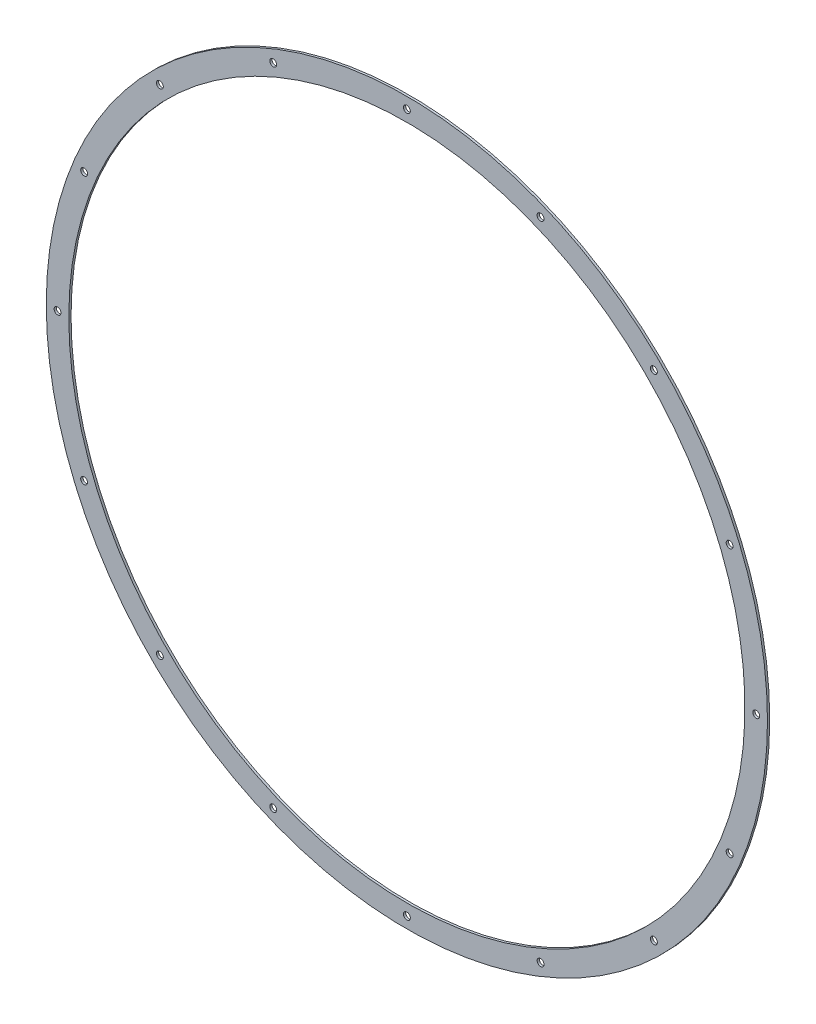
ISO-10303-21;
HEADER;
FILE_DESCRIPTION(('STEP AP214'),'2;1');
FILE_NAME('part.step','',(''),(''),'','','');
FILE_SCHEMA(('AUTOMOTIVE_DESIGN { 1 0 10303 214 1 1 1 1 }'));
ENDSEC;
DATA;
#1=APPLICATION_CONTEXT('core data for automotive mechanical design processes');
#2=APPLICATION_PROTOCOL_DEFINITION('international standard','automotive_design',2000,#1);
#3=PRODUCT_CONTEXT('',#1,'mechanical');
#4=PRODUCT('Part','Part','',(#3));
#5=PRODUCT_RELATED_PRODUCT_CATEGORY('part','',(#4));
#6=PRODUCT_DEFINITION_FORMATION('','',#4);
#7=PRODUCT_DEFINITION_CONTEXT('part definition',#1,'design');
#8=PRODUCT_DEFINITION('design','',#6,#7);
#9=PRODUCT_DEFINITION_SHAPE('','',#8);
#10=(LENGTH_UNIT() NAMED_UNIT(*) SI_UNIT(.MILLI.,.METRE.));
#11=(NAMED_UNIT(*) PLANE_ANGLE_UNIT() SI_UNIT($,.RADIAN.));
#12=(NAMED_UNIT(*) SI_UNIT($,.STERADIAN.) SOLID_ANGLE_UNIT());
#13=UNCERTAINTY_MEASURE_WITH_UNIT(LENGTH_MEASURE(1.E-05),#10,'distance_accuracy_value','');
#14=(GEOMETRIC_REPRESENTATION_CONTEXT(3) GLOBAL_UNCERTAINTY_ASSIGNED_CONTEXT((#13)) GLOBAL_UNIT_ASSIGNED_CONTEXT((#10,
#11,#12)) REPRESENTATION_CONTEXT('',''));
#15=CARTESIAN_POINT('',(0.,0.,0.));
#16=DIRECTION('',(0.,0.,1.));
#17=DIRECTION('',(1.,0.,0.));
#18=AXIS2_PLACEMENT_3D('',#15,#16,#17);
#19=CARTESIAN_POINT('',(-320.,0.,50.));
#20=DIRECTION('',(0.,0.,-1.));
#21=DIRECTION('',(-1.,0.,0.));
#22=AXIS2_PLACEMENT_3D('',#19,#20,#21);
#23=PLANE('',#22);
#24=CARTESIAN_POINT('',(0.,0.,50.));
#25=DIRECTION('',(0.,0.,-1.));
#26=DIRECTION('',(-1.,0.,0.));
#27=AXIS2_PLACEMENT_3D('',#24,#25,#26);
#28=CIRCLE('',#27,300.);
#29=CARTESIAN_POINT('',(-300.,0.,50.));
#30=VERTEX_POINT('',#29);
#31=EDGE_CURVE('E44',#30,#30,#28,.F.);
#32=ORIENTED_EDGE('',*,*,#31,.T.);
#33=EDGE_LOOP('',(#32));
#34=FACE_BOUND('',#33,.T.);
#35=CARTESIAN_POINT('',(-118.631864033174,-286.402655078501,50.));
#36=DIRECTION('',(0.,0.,-1.));
#37=DIRECTION('',(-1.,0.,0.));
#38=AXIS2_PLACEMENT_3D('',#35,#36,#37);
#39=CIRCLE('',#38,3.05000000000001);
#40=CARTESIAN_POINT('',(-121.681864033174,-286.402655078501,50.));
#41=VERTEX_POINT('',#40);
#42=EDGE_CURVE('E97',#41,#41,#39,.F.);
#43=ORIENTED_EDGE('',*,*,#42,.T.);
#44=EDGE_LOOP('',(#43));
#45=FACE_BOUND('',#44,.T.);
#46=CARTESIAN_POINT('',(-219.203102167827,-219.203102167832,50.));
#47=DIRECTION('',(0.,0.,-1.));
#48=DIRECTION('',(-1.,0.,0.));
#49=AXIS2_PLACEMENT_3D('',#46,#47,#48);
#50=CIRCLE('',#49,3.05);
#51=CARTESIAN_POINT('',(-222.253102167827,-219.203102167832,50.));
#52=VERTEX_POINT('',#51);
#53=EDGE_CURVE('E94',#52,#52,#50,.F.);
#54=ORIENTED_EDGE('',*,*,#53,.T.);
#55=EDGE_LOOP('',(#54));
#56=FACE_BOUND('',#55,.T.);
#57=CARTESIAN_POINT('',(-286.402655078498,-118.631864033181,50.));
#58=DIRECTION('',(0.,0.,-1.));
#59=DIRECTION('',(-1.,0.,0.));
#60=AXIS2_PLACEMENT_3D('',#57,#58,#59);
#61=CIRCLE('',#60,3.05);
#62=CARTESIAN_POINT('',(-289.452655078498,-118.631864033181,50.));
#63=VERTEX_POINT('',#62);
#64=EDGE_CURVE('E91',#63,#63,#61,.F.);
#65=ORIENTED_EDGE('',*,*,#64,.T.);
#66=EDGE_LOOP('',(#65));
#67=FACE_BOUND('',#66,.T.);
#68=CARTESIAN_POINT('',(-310.,-3.20911359435055E-12,50.));
#69=DIRECTION('',(0.,0.,-1.));
#70=DIRECTION('',(-1.,0.,0.));
#71=AXIS2_PLACEMENT_3D('',#68,#69,#70);
#72=CIRCLE('',#71,3.05);
#73=CARTESIAN_POINT('',(-313.05,-3.20911359435055E-12,50.));
#74=VERTEX_POINT('',#73);
#75=EDGE_CURVE('E88',#74,#74,#72,.F.);
#76=ORIENTED_EDGE('',*,*,#75,.T.);
#77=EDGE_LOOP('',(#76));
#78=FACE_BOUND('',#77,.T.);
#79=CARTESIAN_POINT('',(-286.4026550785,118.631864033175,50.));
#80=DIRECTION('',(0.,0.,-1.));
#81=DIRECTION('',(-1.,0.,0.));
#82=AXIS2_PLACEMENT_3D('',#79,#80,#81);
#83=CIRCLE('',#82,3.05);
#84=CARTESIAN_POINT('',(-289.4526550785,118.631864033175,50.));
#85=VERTEX_POINT('',#84);
#86=EDGE_CURVE('E85',#85,#85,#83,.F.);
#87=ORIENTED_EDGE('',*,*,#86,.T.);
#88=EDGE_LOOP('',(#87));
#89=FACE_BOUND('',#88,.T.);
#90=CARTESIAN_POINT('',(-219.203102167832,219.203102167828,50.));
#91=DIRECTION('',(0.,0.,-1.));
#92=DIRECTION('',(-1.,0.,0.));
#93=AXIS2_PLACEMENT_3D('',#90,#91,#92);
#94=CIRCLE('',#93,3.05);
#95=CARTESIAN_POINT('',(-222.253102167832,219.203102167828,50.));
#96=VERTEX_POINT('',#95);
#97=EDGE_CURVE('E82',#96,#96,#94,.F.);
#98=ORIENTED_EDGE('',*,*,#97,.T.);
#99=EDGE_LOOP('',(#98));
#100=FACE_BOUND('',#99,.T.);
#101=CARTESIAN_POINT('',(-118.63186403318,286.402655078498,50.));
#102=DIRECTION('',(0.,0.,-1.));
#103=DIRECTION('',(-1.,0.,0.));
#104=AXIS2_PLACEMENT_3D('',#101,#102,#103);
#105=CIRCLE('',#104,3.05000000000001);
#106=CARTESIAN_POINT('',(-121.68186403318,286.402655078498,50.));
#107=VERTEX_POINT('',#106);
#108=EDGE_CURVE('E79',#107,#107,#105,.F.);
#109=ORIENTED_EDGE('',*,*,#108,.T.);
#110=EDGE_LOOP('',(#109));
#111=FACE_BOUND('',#110,.T.);
#112=CARTESIAN_POINT('',(0.,310.,50.));
#113=DIRECTION('',(0.,0.,-1.));
#114=DIRECTION('',(-1.,0.,0.));
#115=AXIS2_PLACEMENT_3D('',#112,#113,#114);
#116=CIRCLE('',#115,3.05);
#117=CARTESIAN_POINT('',(-3.04999999999996,310.,50.));
#118=VERTEX_POINT('',#117);
#119=EDGE_CURVE('E76',#118,#118,#116,.F.);
#120=ORIENTED_EDGE('',*,*,#119,.T.);
#121=EDGE_LOOP('',(#120));
#122=FACE_BOUND('',#121,.T.);
#123=CARTESIAN_POINT('',(118.631864033176,286.4026550785,50.));
#124=DIRECTION('',(0.,0.,-1.));
#125=DIRECTION('',(-1.,0.,0.));
#126=AXIS2_PLACEMENT_3D('',#123,#124,#125);
#127=CIRCLE('',#126,3.05);
#128=CARTESIAN_POINT('',(115.581864033176,286.4026550785,50.));
#129=VERTEX_POINT('',#128);
#130=EDGE_CURVE('E73',#129,#129,#127,.F.);
#131=ORIENTED_EDGE('',*,*,#130,.T.);
#132=EDGE_LOOP('',(#131));
#133=FACE_BOUND('',#132,.T.);
#134=CARTESIAN_POINT('',(219.203102167829,219.203102167831,50.));
#135=DIRECTION('',(0.,0.,-1.));
#136=DIRECTION('',(-1.,0.,0.));
#137=AXIS2_PLACEMENT_3D('',#134,#135,#136);
#138=CIRCLE('',#137,3.05);
#139=CARTESIAN_POINT('',(216.153102167829,219.203102167831,50.));
#140=VERTEX_POINT('',#139);
#141=EDGE_CURVE('E70',#140,#140,#138,.F.);
#142=ORIENTED_EDGE('',*,*,#141,.T.);
#143=EDGE_LOOP('',(#142));
#144=FACE_BOUND('',#143,.T.);
#145=CARTESIAN_POINT('',(286.402655078498,118.631864033179,50.));
#146=DIRECTION('',(0.,0.,-1.));
#147=DIRECTION('',(-1.,0.,0.));
#148=AXIS2_PLACEMENT_3D('',#145,#146,#147);
#149=CIRCLE('',#148,3.05);
#150=CARTESIAN_POINT('',(283.352655078498,118.631864033179,50.));
#151=VERTEX_POINT('',#150);
#152=EDGE_CURVE('E67',#151,#151,#149,.F.);
#153=ORIENTED_EDGE('',*,*,#152,.T.);
#154=EDGE_LOOP('',(#153));
#155=FACE_BOUND('',#154,.T.);
#156=CARTESIAN_POINT('',(310.,1.0443951642678E-12,50.));
#157=DIRECTION('',(0.,0.,-1.));
#158=DIRECTION('',(-1.,0.,0.));
#159=AXIS2_PLACEMENT_3D('',#156,#157,#158);
#160=CIRCLE('',#159,3.05);
#161=CARTESIAN_POINT('',(306.95,1.0443951642678E-12,50.));
#162=VERTEX_POINT('',#161);
#163=EDGE_CURVE('E64',#162,#162,#160,.F.);
#164=ORIENTED_EDGE('',*,*,#163,.T.);
#165=EDGE_LOOP('',(#164));
#166=FACE_BOUND('',#165,.T.);
#167=CARTESIAN_POINT('',(286.402655078499,-118.631864033177,50.));
#168=DIRECTION('',(0.,0.,-1.));
#169=DIRECTION('',(-1.,0.,0.));
#170=AXIS2_PLACEMENT_3D('',#167,#168,#169);
#171=CIRCLE('',#170,3.05);
#172=CARTESIAN_POINT('',(283.352655078499,-118.631864033177,50.));
#173=VERTEX_POINT('',#172);
#174=EDGE_CURVE('E61',#173,#173,#171,.F.);
#175=ORIENTED_EDGE('',*,*,#174,.T.);
#176=EDGE_LOOP('',(#175));
#177=FACE_BOUND('',#176,.T.);
#178=CARTESIAN_POINT('',(219.20310216783,-219.203102167829,50.));
#179=DIRECTION('',(0.,0.,-1.));
#180=DIRECTION('',(-1.,0.,0.));
#181=AXIS2_PLACEMENT_3D('',#178,#179,#180);
#182=CIRCLE('',#181,3.05);
#183=CARTESIAN_POINT('',(216.15310216783,-219.203102167829,50.));
#184=VERTEX_POINT('',#183);
#185=EDGE_CURVE('E58',#184,#184,#182,.F.);
#186=ORIENTED_EDGE('',*,*,#185,.T.);
#187=EDGE_LOOP('',(#186));
#188=FACE_BOUND('',#187,.T.);
#189=CARTESIAN_POINT('',(118.631864033178,-286.402655078499,50.));
#190=DIRECTION('',(0.,0.,-1.));
#191=DIRECTION('',(-1.,0.,0.));
#192=AXIS2_PLACEMENT_3D('',#189,#190,#191);
#193=CIRCLE('',#192,3.04999999999998);
#194=CARTESIAN_POINT('',(115.581864033178,-286.402655078499,50.));
#195=VERTEX_POINT('',#194);
#196=EDGE_CURVE('E53',#195,#195,#193,.F.);
#197=ORIENTED_EDGE('',*,*,#196,.T.);
#198=EDGE_LOOP('',(#197));
#199=FACE_BOUND('',#198,.T.);
#200=CARTESIAN_POINT('',(0.,-310.,50.));
#201=DIRECTION('',(0.,0.,-1.));
#202=DIRECTION('',(-1.,0.,0.));
#203=AXIS2_PLACEMENT_3D('',#200,#201,#202);
#204=CIRCLE('',#203,3.05);
#205=CARTESIAN_POINT('',(-3.05000000000004,-310.,50.));
#206=VERTEX_POINT('',#205);
#207=EDGE_CURVE('E48',#206,#206,#204,.F.);
#208=ORIENTED_EDGE('',*,*,#207,.T.);
#209=EDGE_LOOP('',(#208));
#210=FACE_BOUND('',#209,.T.);
#211=CARTESIAN_POINT('',(0.,0.,50.));
#212=DIRECTION('',(0.,0.,-1.));
#213=DIRECTION('',(-1.,0.,0.));
#214=AXIS2_PLACEMENT_3D('',#211,#212,#213);
#215=CIRCLE('',#214,320.);
#216=CARTESIAN_POINT('',(-320.,0.,50.));
#217=VERTEX_POINT('',#216);
#218=EDGE_CURVE('E10',#217,#217,#215,.F.);
#219=ORIENTED_EDGE('',*,*,#218,.F.);
#220=EDGE_LOOP('',(#219));
#221=FACE_BOUND('',#220,.T.);
#222=ADVANCED_FACE('F40',(#34,#45,#56,#67,#78,#89,#100,#111,#122,#133,#144,#155,#166,#177,#188,
#199,#210,#221),#23,.T.);
#223=CARTESIAN_POINT('',(0.,0.,52.));
#224=DIRECTION('',(0.,0.,1.));
#225=DIRECTION('',(1.,0.,0.));
#226=AXIS2_PLACEMENT_3D('',#223,#224,#225);
#227=PLANE('',#226);
#228=CARTESIAN_POINT('',(-118.631864033174,-286.402655078501,52.));
#229=DIRECTION('',(0.,0.,-1.));
#230=DIRECTION('',(-1.,0.,0.));
#231=AXIS2_PLACEMENT_3D('',#228,#229,#230);
#232=CIRCLE('',#231,3.05000000000001);
#233=CARTESIAN_POINT('',(-121.681864033174,-286.402655078501,52.));
#234=VERTEX_POINT('',#233);
#235=EDGE_CURVE('E148',#234,#234,#232,.T.);
#236=ORIENTED_EDGE('',*,*,#235,.T.);
#237=EDGE_LOOP('',(#236));
#238=FACE_BOUND('',#237,.T.);
#239=CARTESIAN_POINT('',(-219.203102167827,-219.203102167832,52.));
#240=DIRECTION('',(0.,0.,-1.));
#241=DIRECTION('',(-1.,0.,0.));
#242=AXIS2_PLACEMENT_3D('',#239,#240,#241);
#243=CIRCLE('',#242,3.05);
#244=CARTESIAN_POINT('',(-222.253102167827,-219.203102167832,52.));
#245=VERTEX_POINT('',#244);
#246=EDGE_CURVE('E145',#245,#245,#243,.T.);
#247=ORIENTED_EDGE('',*,*,#246,.T.);
#248=EDGE_LOOP('',(#247));
#249=FACE_BOUND('',#248,.T.);
#250=CARTESIAN_POINT('',(-286.402655078498,-118.631864033181,52.));
#251=DIRECTION('',(0.,0.,-1.));
#252=DIRECTION('',(-1.,0.,0.));
#253=AXIS2_PLACEMENT_3D('',#250,#251,#252);
#254=CIRCLE('',#253,3.05);
#255=CARTESIAN_POINT('',(-289.452655078498,-118.631864033181,52.));
#256=VERTEX_POINT('',#255);
#257=EDGE_CURVE('E142',#256,#256,#254,.T.);
#258=ORIENTED_EDGE('',*,*,#257,.T.);
#259=EDGE_LOOP('',(#258));
#260=FACE_BOUND('',#259,.T.);
#261=CARTESIAN_POINT('',(-310.,-3.20911359435055E-12,52.));
#262=DIRECTION('',(0.,0.,-1.));
#263=DIRECTION('',(-1.,0.,0.));
#264=AXIS2_PLACEMENT_3D('',#261,#262,#263);
#265=CIRCLE('',#264,3.05);
#266=CARTESIAN_POINT('',(-313.05,-3.20911359435055E-12,52.));
#267=VERTEX_POINT('',#266);
#268=EDGE_CURVE('E139',#267,#267,#265,.T.);
#269=ORIENTED_EDGE('',*,*,#268,.T.);
#270=EDGE_LOOP('',(#269));
#271=FACE_BOUND('',#270,.T.);
#272=CARTESIAN_POINT('',(-286.4026550785,118.631864033175,52.));
#273=DIRECTION('',(0.,0.,-1.));
#274=DIRECTION('',(-1.,0.,0.));
#275=AXIS2_PLACEMENT_3D('',#272,#273,#274);
#276=CIRCLE('',#275,3.05);
#277=CARTESIAN_POINT('',(-289.4526550785,118.631864033175,52.));
#278=VERTEX_POINT('',#277);
#279=EDGE_CURVE('E136',#278,#278,#276,.T.);
#280=ORIENTED_EDGE('',*,*,#279,.T.);
#281=EDGE_LOOP('',(#280));
#282=FACE_BOUND('',#281,.T.);
#283=CARTESIAN_POINT('',(-219.203102167832,219.203102167828,52.));
#284=DIRECTION('',(0.,0.,-1.));
#285=DIRECTION('',(-1.,0.,0.));
#286=AXIS2_PLACEMENT_3D('',#283,#284,#285);
#287=CIRCLE('',#286,3.05);
#288=CARTESIAN_POINT('',(-222.253102167832,219.203102167828,52.));
#289=VERTEX_POINT('',#288);
#290=EDGE_CURVE('E133',#289,#289,#287,.T.);
#291=ORIENTED_EDGE('',*,*,#290,.T.);
#292=EDGE_LOOP('',(#291));
#293=FACE_BOUND('',#292,.T.);
#294=CARTESIAN_POINT('',(-118.63186403318,286.402655078498,52.));
#295=DIRECTION('',(0.,0.,-1.));
#296=DIRECTION('',(-1.,0.,0.));
#297=AXIS2_PLACEMENT_3D('',#294,#295,#296);
#298=CIRCLE('',#297,3.05000000000001);
#299=CARTESIAN_POINT('',(-121.68186403318,286.402655078498,52.));
#300=VERTEX_POINT('',#299);
#301=EDGE_CURVE('E130',#300,#300,#298,.T.);
#302=ORIENTED_EDGE('',*,*,#301,.T.);
#303=EDGE_LOOP('',(#302));
#304=FACE_BOUND('',#303,.T.);
#305=CARTESIAN_POINT('',(0.,310.,52.));
#306=DIRECTION('',(0.,0.,-1.));
#307=DIRECTION('',(-1.,0.,0.));
#308=AXIS2_PLACEMENT_3D('',#305,#306,#307);
#309=CIRCLE('',#308,3.05);
#310=CARTESIAN_POINT('',(-3.04999999999996,310.,52.));
#311=VERTEX_POINT('',#310);
#312=EDGE_CURVE('E127',#311,#311,#309,.T.);
#313=ORIENTED_EDGE('',*,*,#312,.T.);
#314=EDGE_LOOP('',(#313));
#315=FACE_BOUND('',#314,.T.);
#316=CARTESIAN_POINT('',(118.631864033176,286.4026550785,52.));
#317=DIRECTION('',(0.,0.,-1.));
#318=DIRECTION('',(-1.,0.,0.));
#319=AXIS2_PLACEMENT_3D('',#316,#317,#318);
#320=CIRCLE('',#319,3.05);
#321=CARTESIAN_POINT('',(115.581864033176,286.4026550785,52.));
#322=VERTEX_POINT('',#321);
#323=EDGE_CURVE('E124',#322,#322,#320,.T.);
#324=ORIENTED_EDGE('',*,*,#323,.T.);
#325=EDGE_LOOP('',(#324));
#326=FACE_BOUND('',#325,.T.);
#327=CARTESIAN_POINT('',(219.203102167829,219.203102167831,52.));
#328=DIRECTION('',(0.,0.,-1.));
#329=DIRECTION('',(-1.,0.,0.));
#330=AXIS2_PLACEMENT_3D('',#327,#328,#329);
#331=CIRCLE('',#330,3.05);
#332=CARTESIAN_POINT('',(216.153102167829,219.203102167831,52.));
#333=VERTEX_POINT('',#332);
#334=EDGE_CURVE('E121',#333,#333,#331,.T.);
#335=ORIENTED_EDGE('',*,*,#334,.T.);
#336=EDGE_LOOP('',(#335));
#337=FACE_BOUND('',#336,.T.);
#338=CARTESIAN_POINT('',(286.402655078498,118.631864033179,52.));
#339=DIRECTION('',(0.,0.,-1.));
#340=DIRECTION('',(-1.,0.,0.));
#341=AXIS2_PLACEMENT_3D('',#338,#339,#340);
#342=CIRCLE('',#341,3.05);
#343=CARTESIAN_POINT('',(283.352655078498,118.631864033179,52.));
#344=VERTEX_POINT('',#343);
#345=EDGE_CURVE('E118',#344,#344,#342,.T.);
#346=ORIENTED_EDGE('',*,*,#345,.T.);
#347=EDGE_LOOP('',(#346));
#348=FACE_BOUND('',#347,.T.);
#349=CARTESIAN_POINT('',(310.,1.0443951642678E-12,52.));
#350=DIRECTION('',(0.,0.,-1.));
#351=DIRECTION('',(-1.,0.,0.));
#352=AXIS2_PLACEMENT_3D('',#349,#350,#351);
#353=CIRCLE('',#352,3.05);
#354=CARTESIAN_POINT('',(306.95,1.0443951642678E-12,52.));
#355=VERTEX_POINT('',#354);
#356=EDGE_CURVE('E115',#355,#355,#353,.T.);
#357=ORIENTED_EDGE('',*,*,#356,.T.);
#358=EDGE_LOOP('',(#357));
#359=FACE_BOUND('',#358,.T.);
#360=CARTESIAN_POINT('',(286.402655078499,-118.631864033177,52.));
#361=DIRECTION('',(0.,0.,-1.));
#362=DIRECTION('',(-1.,0.,0.));
#363=AXIS2_PLACEMENT_3D('',#360,#361,#362);
#364=CIRCLE('',#363,3.05);
#365=CARTESIAN_POINT('',(283.352655078499,-118.631864033177,52.));
#366=VERTEX_POINT('',#365);
#367=EDGE_CURVE('E112',#366,#366,#364,.T.);
#368=ORIENTED_EDGE('',*,*,#367,.T.);
#369=EDGE_LOOP('',(#368));
#370=FACE_BOUND('',#369,.T.);
#371=CARTESIAN_POINT('',(219.20310216783,-219.203102167829,52.));
#372=DIRECTION('',(0.,0.,-1.));
#373=DIRECTION('',(-1.,0.,0.));
#374=AXIS2_PLACEMENT_3D('',#371,#372,#373);
#375=CIRCLE('',#374,3.05);
#376=CARTESIAN_POINT('',(216.15310216783,-219.203102167829,52.));
#377=VERTEX_POINT('',#376);
#378=EDGE_CURVE('E109',#377,#377,#375,.T.);
#379=ORIENTED_EDGE('',*,*,#378,.T.);
#380=EDGE_LOOP('',(#379));
#381=FACE_BOUND('',#380,.T.);
#382=CARTESIAN_POINT('',(118.631864033178,-286.402655078499,52.));
#383=DIRECTION('',(0.,0.,-1.));
#384=DIRECTION('',(-1.,0.,0.));
#385=AXIS2_PLACEMENT_3D('',#382,#383,#384);
#386=CIRCLE('',#385,3.04999999999998);
#387=CARTESIAN_POINT('',(115.581864033178,-286.402655078499,52.));
#388=VERTEX_POINT('',#387);
#389=EDGE_CURVE('E106',#388,#388,#386,.T.);
#390=ORIENTED_EDGE('',*,*,#389,.T.);
#391=EDGE_LOOP('',(#390));
#392=FACE_BOUND('',#391,.T.);
#393=CARTESIAN_POINT('',(0.,-310.,52.));
#394=DIRECTION('',(0.,0.,-1.));
#395=DIRECTION('',(-1.,0.,0.));
#396=AXIS2_PLACEMENT_3D('',#393,#394,#395);
#397=CIRCLE('',#396,3.05);
#398=CARTESIAN_POINT('',(-3.05000000000004,-310.,52.));
#399=VERTEX_POINT('',#398);
#400=EDGE_CURVE('E103',#399,#399,#397,.T.);
#401=ORIENTED_EDGE('',*,*,#400,.T.);
#402=EDGE_LOOP('',(#401));
#403=FACE_BOUND('',#402,.T.);
#404=CARTESIAN_POINT('',(0.,0.,52.));
#405=DIRECTION('',(0.,0.,-1.));
#406=DIRECTION('',(-1.,0.,0.));
#407=AXIS2_PLACEMENT_3D('',#404,#405,#406);
#408=CIRCLE('',#407,300.);
#409=CARTESIAN_POINT('',(-300.,0.,52.));
#410=VERTEX_POINT('',#409);
#411=EDGE_CURVE('E150',#410,#410,#408,.T.);
#412=ORIENTED_EDGE('',*,*,#411,.T.);
#413=EDGE_LOOP('',(#412));
#414=FACE_BOUND('',#413,.T.);
#415=CARTESIAN_POINT('',(0.,0.,52.));
#416=DIRECTION('',(0.,0.,-1.));
#417=DIRECTION('',(-1.,0.,0.));
#418=AXIS2_PLACEMENT_3D('',#415,#416,#417);
#419=CIRCLE('',#418,320.);
#420=CARTESIAN_POINT('',(-320.,0.,52.));
#421=VERTEX_POINT('',#420);
#422=EDGE_CURVE('E100',#421,#421,#419,.F.);
#423=ORIENTED_EDGE('',*,*,#422,.T.);
#424=EDGE_LOOP('',(#423));
#425=FACE_BOUND('',#424,.T.);
#426=ADVANCED_FACE('F161',(#238,#249,#260,#271,#282,#293,#304,#315,#326,#337,#348,#359,#370,
#381,#392,#403,#414,#425),#227,.T.);
#427=CARTESIAN_POINT('',(0.,0.,50.));
#428=DIRECTION('',(0.,0.,-1.));
#429=DIRECTION('',(-1.,0.,0.));
#430=AXIS2_PLACEMENT_3D('',#427,#428,#429);
#431=CYLINDRICAL_SURFACE('',#430,300.);
#432=ORIENTED_EDGE('',*,*,#411,.F.);
#433=EDGE_LOOP('',(#432));
#434=FACE_BOUND('',#433,.T.);
#435=ORIENTED_EDGE('',*,*,#31,.F.);
#436=EDGE_LOOP('',(#435));
#437=FACE_BOUND('',#436,.T.);
#438=ADVANCED_FACE('F42',(#434,#437),#431,.F.);
#439=CARTESIAN_POINT('',(-118.631864033174,-286.402655078501,52.));
#440=DIRECTION('',(0.,0.,-1.));
#441=DIRECTION('',(-1.,0.,0.));
#442=AXIS2_PLACEMENT_3D('',#439,#440,#441);
#443=CYLINDRICAL_SURFACE('',#442,3.05000000000001);
#444=ORIENTED_EDGE('',*,*,#42,.F.);
#445=EDGE_LOOP('',(#444));
#446=FACE_BOUND('',#445,.T.);
#447=ORIENTED_EDGE('',*,*,#235,.F.);
#448=EDGE_LOOP('',(#447));
#449=FACE_BOUND('',#448,.T.);
#450=ADVANCED_FACE('F160',(#446,#449),#443,.F.);
#451=CARTESIAN_POINT('',(-219.203102167827,-219.203102167832,52.));
#452=DIRECTION('',(0.,0.,-1.));
#453=DIRECTION('',(-1.,0.,0.));
#454=AXIS2_PLACEMENT_3D('',#451,#452,#453);
#455=CYLINDRICAL_SURFACE('',#454,3.05);
#456=ORIENTED_EDGE('',*,*,#53,.F.);
#457=EDGE_LOOP('',(#456));
#458=FACE_BOUND('',#457,.T.);
#459=ORIENTED_EDGE('',*,*,#246,.F.);
#460=EDGE_LOOP('',(#459));
#461=FACE_BOUND('',#460,.T.);
#462=ADVANCED_FACE('F167',(#458,#461),#455,.F.);
#463=CARTESIAN_POINT('',(-286.402655078498,-118.631864033181,52.));
#464=DIRECTION('',(0.,0.,-1.));
#465=DIRECTION('',(-1.,0.,0.));
#466=AXIS2_PLACEMENT_3D('',#463,#464,#465);
#467=CYLINDRICAL_SURFACE('',#466,3.05);
#468=ORIENTED_EDGE('',*,*,#64,.F.);
#469=EDGE_LOOP('',(#468));
#470=FACE_BOUND('',#469,.T.);
#471=ORIENTED_EDGE('',*,*,#257,.F.);
#472=EDGE_LOOP('',(#471));
#473=FACE_BOUND('',#472,.T.);
#474=ADVANCED_FACE('F180',(#470,#473),#467,.F.);
#475=CARTESIAN_POINT('',(-310.,-3.20911359435055E-12,52.));
#476=DIRECTION('',(0.,0.,-1.));
#477=DIRECTION('',(-1.,0.,0.));
#478=AXIS2_PLACEMENT_3D('',#475,#476,#477);
#479=CYLINDRICAL_SURFACE('',#478,3.05);
#480=ORIENTED_EDGE('',*,*,#75,.F.);
#481=EDGE_LOOP('',(#480));
#482=FACE_BOUND('',#481,.T.);
#483=ORIENTED_EDGE('',*,*,#268,.F.);
#484=EDGE_LOOP('',(#483));
#485=FACE_BOUND('',#484,.T.);
#486=ADVANCED_FACE('F184',(#482,#485),#479,.F.);
#487=CARTESIAN_POINT('',(-286.4026550785,118.631864033175,52.));
#488=DIRECTION('',(0.,0.,-1.));
#489=DIRECTION('',(-1.,0.,0.));
#490=AXIS2_PLACEMENT_3D('',#487,#488,#489);
#491=CYLINDRICAL_SURFACE('',#490,3.05);
#492=ORIENTED_EDGE('',*,*,#86,.F.);
#493=EDGE_LOOP('',(#492));
#494=FACE_BOUND('',#493,.T.);
#495=ORIENTED_EDGE('',*,*,#279,.F.);
#496=EDGE_LOOP('',(#495));
#497=FACE_BOUND('',#496,.T.);
#498=ADVANCED_FACE('F188',(#494,#497),#491,.F.);
#499=CARTESIAN_POINT('',(-219.203102167832,219.203102167828,52.));
#500=DIRECTION('',(0.,0.,-1.));
#501=DIRECTION('',(-1.,0.,0.));
#502=AXIS2_PLACEMENT_3D('',#499,#500,#501);
#503=CYLINDRICAL_SURFACE('',#502,3.05);
#504=ORIENTED_EDGE('',*,*,#97,.F.);
#505=EDGE_LOOP('',(#504));
#506=FACE_BOUND('',#505,.T.);
#507=ORIENTED_EDGE('',*,*,#290,.F.);
#508=EDGE_LOOP('',(#507));
#509=FACE_BOUND('',#508,.T.);
#510=ADVANCED_FACE('F192',(#506,#509),#503,.F.);
#511=CARTESIAN_POINT('',(-118.63186403318,286.402655078498,52.));
#512=DIRECTION('',(0.,0.,-1.));
#513=DIRECTION('',(-1.,0.,0.));
#514=AXIS2_PLACEMENT_3D('',#511,#512,#513);
#515=CYLINDRICAL_SURFACE('',#514,3.05000000000001);
#516=ORIENTED_EDGE('',*,*,#108,.F.);
#517=EDGE_LOOP('',(#516));
#518=FACE_BOUND('',#517,.T.);
#519=ORIENTED_EDGE('',*,*,#301,.F.);
#520=EDGE_LOOP('',(#519));
#521=FACE_BOUND('',#520,.T.);
#522=ADVANCED_FACE('F196',(#518,#521),#515,.F.);
#523=CARTESIAN_POINT('',(0.,310.,52.));
#524=DIRECTION('',(0.,0.,-1.));
#525=DIRECTION('',(-1.,0.,0.));
#526=AXIS2_PLACEMENT_3D('',#523,#524,#525);
#527=CYLINDRICAL_SURFACE('',#526,3.05);
#528=ORIENTED_EDGE('',*,*,#119,.F.);
#529=EDGE_LOOP('',(#528));
#530=FACE_BOUND('',#529,.T.);
#531=ORIENTED_EDGE('',*,*,#312,.F.);
#532=EDGE_LOOP('',(#531));
#533=FACE_BOUND('',#532,.T.);
#534=ADVANCED_FACE('F200',(#530,#533),#527,.F.);
#535=CARTESIAN_POINT('',(118.631864033176,286.4026550785,52.));
#536=DIRECTION('',(0.,0.,-1.));
#537=DIRECTION('',(-1.,0.,0.));
#538=AXIS2_PLACEMENT_3D('',#535,#536,#537);
#539=CYLINDRICAL_SURFACE('',#538,3.05);
#540=ORIENTED_EDGE('',*,*,#130,.F.);
#541=EDGE_LOOP('',(#540));
#542=FACE_BOUND('',#541,.T.);
#543=ORIENTED_EDGE('',*,*,#323,.F.);
#544=EDGE_LOOP('',(#543));
#545=FACE_BOUND('',#544,.T.);
#546=ADVANCED_FACE('F204',(#542,#545),#539,.F.);
#547=CARTESIAN_POINT('',(219.203102167829,219.203102167831,52.));
#548=DIRECTION('',(0.,0.,-1.));
#549=DIRECTION('',(-1.,0.,0.));
#550=AXIS2_PLACEMENT_3D('',#547,#548,#549);
#551=CYLINDRICAL_SURFACE('',#550,3.05);
#552=ORIENTED_EDGE('',*,*,#141,.F.);
#553=EDGE_LOOP('',(#552));
#554=FACE_BOUND('',#553,.T.);
#555=ORIENTED_EDGE('',*,*,#334,.F.);
#556=EDGE_LOOP('',(#555));
#557=FACE_BOUND('',#556,.T.);
#558=ADVANCED_FACE('F208',(#554,#557),#551,.F.);
#559=CARTESIAN_POINT('',(286.402655078498,118.631864033179,52.));
#560=DIRECTION('',(0.,0.,-1.));
#561=DIRECTION('',(-1.,0.,0.));
#562=AXIS2_PLACEMENT_3D('',#559,#560,#561);
#563=CYLINDRICAL_SURFACE('',#562,3.05);
#564=ORIENTED_EDGE('',*,*,#152,.F.);
#565=EDGE_LOOP('',(#564));
#566=FACE_BOUND('',#565,.T.);
#567=ORIENTED_EDGE('',*,*,#345,.F.);
#568=EDGE_LOOP('',(#567));
#569=FACE_BOUND('',#568,.T.);
#570=ADVANCED_FACE('F212',(#566,#569),#563,.F.);
#571=CARTESIAN_POINT('',(310.,1.0443951642678E-12,52.));
#572=DIRECTION('',(0.,0.,-1.));
#573=DIRECTION('',(-1.,0.,0.));
#574=AXIS2_PLACEMENT_3D('',#571,#572,#573);
#575=CYLINDRICAL_SURFACE('',#574,3.05);
#576=ORIENTED_EDGE('',*,*,#163,.F.);
#577=EDGE_LOOP('',(#576));
#578=FACE_BOUND('',#577,.T.);
#579=ORIENTED_EDGE('',*,*,#356,.F.);
#580=EDGE_LOOP('',(#579));
#581=FACE_BOUND('',#580,.T.);
#582=ADVANCED_FACE('F216',(#578,#581),#575,.F.);
#583=CARTESIAN_POINT('',(286.402655078499,-118.631864033177,52.));
#584=DIRECTION('',(0.,0.,-1.));
#585=DIRECTION('',(-1.,0.,0.));
#586=AXIS2_PLACEMENT_3D('',#583,#584,#585);
#587=CYLINDRICAL_SURFACE('',#586,3.05);
#588=ORIENTED_EDGE('',*,*,#174,.F.);
#589=EDGE_LOOP('',(#588));
#590=FACE_BOUND('',#589,.T.);
#591=ORIENTED_EDGE('',*,*,#367,.F.);
#592=EDGE_LOOP('',(#591));
#593=FACE_BOUND('',#592,.T.);
#594=ADVANCED_FACE('F220',(#590,#593),#587,.F.);
#595=CARTESIAN_POINT('',(219.20310216783,-219.203102167829,52.));
#596=DIRECTION('',(0.,0.,-1.));
#597=DIRECTION('',(-1.,0.,0.));
#598=AXIS2_PLACEMENT_3D('',#595,#596,#597);
#599=CYLINDRICAL_SURFACE('',#598,3.05);
#600=ORIENTED_EDGE('',*,*,#185,.F.);
#601=EDGE_LOOP('',(#600));
#602=FACE_BOUND('',#601,.T.);
#603=ORIENTED_EDGE('',*,*,#378,.F.);
#604=EDGE_LOOP('',(#603));
#605=FACE_BOUND('',#604,.T.);
#606=ADVANCED_FACE('F224',(#602,#605),#599,.F.);
#607=CARTESIAN_POINT('',(118.631864033178,-286.402655078499,52.));
#608=DIRECTION('',(0.,0.,-1.));
#609=DIRECTION('',(-1.,0.,0.));
#610=AXIS2_PLACEMENT_3D('',#607,#608,#609);
#611=CYLINDRICAL_SURFACE('',#610,3.04999999999998);
#612=ORIENTED_EDGE('',*,*,#196,.F.);
#613=EDGE_LOOP('',(#612));
#614=FACE_BOUND('',#613,.T.);
#615=ORIENTED_EDGE('',*,*,#389,.F.);
#616=EDGE_LOOP('',(#615));
#617=FACE_BOUND('',#616,.T.);
#618=ADVANCED_FACE('F228',(#614,#617),#611,.F.);
#619=CARTESIAN_POINT('',(0.,-310.,52.));
#620=DIRECTION('',(0.,0.,-1.));
#621=DIRECTION('',(-1.,0.,0.));
#622=AXIS2_PLACEMENT_3D('',#619,#620,#621);
#623=CYLINDRICAL_SURFACE('',#622,3.05);
#624=ORIENTED_EDGE('',*,*,#207,.F.);
#625=EDGE_LOOP('',(#624));
#626=FACE_BOUND('',#625,.T.);
#627=ORIENTED_EDGE('',*,*,#400,.F.);
#628=EDGE_LOOP('',(#627));
#629=FACE_BOUND('',#628,.T.);
#630=ADVANCED_FACE('F232',(#626,#629),#623,.F.);
#631=CARTESIAN_POINT('',(0.,0.,52.));
#632=DIRECTION('',(0.,0.,-1.));
#633=DIRECTION('',(-1.,0.,0.));
#634=AXIS2_PLACEMENT_3D('',#631,#632,#633);
#635=CYLINDRICAL_SURFACE('',#634,320.);
#636=ORIENTED_EDGE('',*,*,#218,.T.);
#637=EDGE_LOOP('',(#636));
#638=FACE_BOUND('',#637,.T.);
#639=ORIENTED_EDGE('',*,*,#422,.F.);
#640=EDGE_LOOP('',(#639));
#641=FACE_BOUND('',#640,.T.);
#642=ADVANCED_FACE('F175',(#638,#641),#635,.T.);
#643=CLOSED_SHELL('',(#222,#426,#438,#450,#462,#474,#486,#498,#510,#522,#534,#546,#558,#570,
#582,#594,#606,#618,#630,#642));
#644=MANIFOLD_SOLID_BREP('B2',#643);
#645=ADVANCED_BREP_SHAPE_REPRESENTATION('',(#18,#644),#14);
#646=SHAPE_DEFINITION_REPRESENTATION(#9,#645);
ENDSEC;
END-ISO-10303-21;
